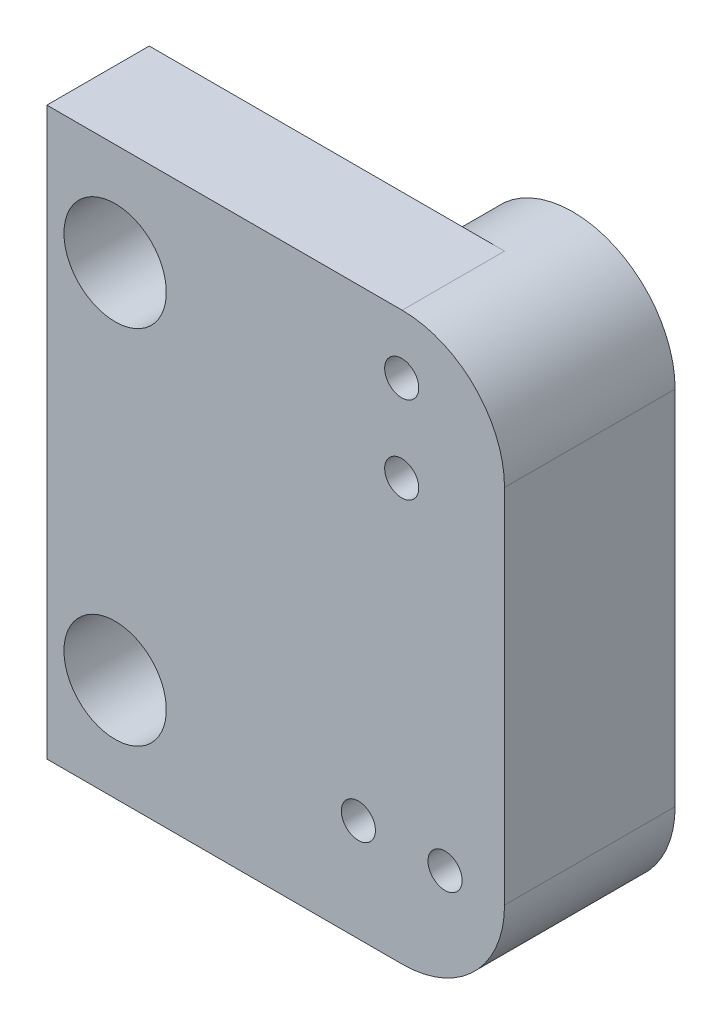
ISO-10303-21;
HEADER;
FILE_DESCRIPTION(('STEP AP214'),'2;1');
FILE_NAME('part.step','',(''),(''),'','','');
FILE_SCHEMA(('AUTOMOTIVE_DESIGN { 1 0 10303 214 1 1 1 1 }'));
ENDSEC;
DATA;
#1=APPLICATION_CONTEXT('core data for automotive mechanical design processes');
#2=APPLICATION_PROTOCOL_DEFINITION('international standard','automotive_design',2000,#1);
#3=PRODUCT_CONTEXT('',#1,'mechanical');
#4=PRODUCT('Part','Part','',(#3));
#5=PRODUCT_RELATED_PRODUCT_CATEGORY('part','',(#4));
#6=PRODUCT_DEFINITION_FORMATION('','',#4);
#7=PRODUCT_DEFINITION_CONTEXT('part definition',#1,'design');
#8=PRODUCT_DEFINITION('design','',#6,#7);
#9=PRODUCT_DEFINITION_SHAPE('','',#8);
#10=(LENGTH_UNIT() NAMED_UNIT(*) SI_UNIT(.MILLI.,.METRE.));
#11=(NAMED_UNIT(*) PLANE_ANGLE_UNIT() SI_UNIT($,.RADIAN.));
#12=(NAMED_UNIT(*) SI_UNIT($,.STERADIAN.) SOLID_ANGLE_UNIT());
#13=UNCERTAINTY_MEASURE_WITH_UNIT(LENGTH_MEASURE(1.E-05),#10,'distance_accuracy_value','');
#14=(GEOMETRIC_REPRESENTATION_CONTEXT(3) GLOBAL_UNCERTAINTY_ASSIGNED_CONTEXT((#13)) GLOBAL_UNIT_ASSIGNED_CONTEXT((#10,
#11,#12)) REPRESENTATION_CONTEXT('',''));
#15=CARTESIAN_POINT('',(0.,0.,0.));
#16=DIRECTION('',(0.,0.,1.));
#17=DIRECTION('',(1.,0.,0.));
#18=AXIS2_PLACEMENT_3D('',#15,#16,#17);
#19=CARTESIAN_POINT('',(0.,5.27451513374679,-6.28985821859934));
#20=DIRECTION('',(0.,-1.,0.));
#21=DIRECTION('',(1.,0.,0.));
#22=AXIS2_PLACEMENT_3D('',#19,#20,#21);
#23=PLANE('',#22);
#24=DIRECTION('',(1.,0.,0.));
#25=VECTOR('',#24,1.);
#26=CARTESIAN_POINT('',(0.,5.27451513374679,-6.28985821859934));
#27=LINE('',#26,#25);
#28=CARTESIAN_POINT('',(-15.5390857664016,5.2745151337468,-6.28985821859934));
#29=VERTEX_POINT('',#28);
#30=CARTESIAN_POINT('',(-5.12559757679926,5.27451513374679,-6.28985821859934));
#31=VERTEX_POINT('',#30);
#32=EDGE_CURVE('E119',#29,#31,#27,.T.);
#33=ORIENTED_EDGE('',*,*,#32,.T.);
#34=DIRECTION('',(0.,0.,-1.));
#35=VECTOR('',#34,1.);
#36=CARTESIAN_POINT('',(-5.12559757679926,5.27451513374679,3.71014178140066));
#37=LINE('',#36,#35);
#38=CARTESIAN_POINT('',(-5.12559757679926,5.27451513374679,-3.28985821859934));
#39=VERTEX_POINT('',#38);
#40=EDGE_CURVE('E101',#39,#31,#37,.T.);
#41=ORIENTED_EDGE('',*,*,#40,.F.);
#42=DIRECTION('',(1.,0.,0.));
#43=VECTOR('',#42,1.);
#44=CARTESIAN_POINT('',(0.,5.27451513374679,-3.28985821859934));
#45=LINE('',#44,#43);
#46=CARTESIAN_POINT('',(-15.5390857664016,5.2745151337468,-3.28985821859934));
#47=VERTEX_POINT('',#46);
#48=EDGE_CURVE('E146',#47,#39,#45,.T.);
#49=ORIENTED_EDGE('',*,*,#48,.F.);
#50=DIRECTION('',(0.,0.,1.));
#51=VECTOR('',#50,1.);
#52=CARTESIAN_POINT('',(-15.5390857664016,5.2745151337468,-6.28985821859934));
#53=LINE('',#52,#51);
#54=EDGE_CURVE('E124',#29,#47,#53,.T.);
#55=ORIENTED_EDGE('',*,*,#54,.F.);
#56=EDGE_LOOP('',(#33,#41,#49,#55));
#57=FACE_BOUND('',#56,.T.);
#58=ADVANCED_FACE('F36',(#57),#23,.T.);
#59=CARTESIAN_POINT('',(-5.12559757679926,8.27451513374679,-3.28985821859934));
#60=DIRECTION('',(0.,0.,-1.));
#61=DIRECTION('',(-1.,0.,0.));
#62=AXIS2_PLACEMENT_3D('',#59,#60,#61);
#63=PLANE('',#62);
#64=CARTESIAN_POINT('',(-13.5390857664016,18.8745151337471,-3.28985821859934));
#65=DIRECTION('',(0.,0.,-1.));
#66=DIRECTION('',(-1.,0.,0.));
#67=AXIS2_PLACEMENT_3D('',#64,#65,#66);
#68=CIRCLE('',#67,1.5);
#69=CARTESIAN_POINT('',(-15.0390857664016,18.8745151337471,-3.28985821859934));
#70=VERTEX_POINT('',#69);
#71=EDGE_CURVE('E127',#70,#70,#68,.T.);
#72=ORIENTED_EDGE('',*,*,#71,.T.);
#73=EDGE_LOOP('',(#72));
#74=FACE_BOUND('',#73,.T.);
#75=CARTESIAN_POINT('',(-13.5390857664016,8.27451513374718,-3.28985821859934));
#76=DIRECTION('',(0.,0.,-1.));
#77=DIRECTION('',(-1.,0.,0.));
#78=AXIS2_PLACEMENT_3D('',#75,#76,#77);
#79=CIRCLE('',#78,1.5);
#80=CARTESIAN_POINT('',(-15.0390857664016,8.27451513374718,-3.28985821859934));
#81=VERTEX_POINT('',#80);
#82=EDGE_CURVE('E132',#81,#81,#79,.T.);
#83=ORIENTED_EDGE('',*,*,#82,.T.);
#84=EDGE_LOOP('',(#83));
#85=FACE_BOUND('',#84,.T.);
#86=CARTESIAN_POINT('',(-6.40908576640162,8.27451513374708,-3.28985821859934));
#87=DIRECTION('',(0.,0.,-1.));
#88=DIRECTION('',(-1.,0.,0.));
#89=AXIS2_PLACEMENT_3D('',#86,#87,#88);
#90=CIRCLE('',#89,0.500000000000001);
#91=CARTESIAN_POINT('',(-6.90908576640162,8.27451513374708,-3.28985821859934));
#92=VERTEX_POINT('',#91);
#93=EDGE_CURVE('E209',#92,#92,#90,.T.);
#94=ORIENTED_EDGE('',*,*,#93,.T.);
#95=EDGE_LOOP('',(#94));
#96=FACE_BOUND('',#95,.T.);
#97=CARTESIAN_POINT('',(-3.86908576640163,8.27451513374708,-3.28985821859934));
#98=DIRECTION('',(0.,0.,-1.));
#99=DIRECTION('',(-1.,0.,0.));
#100=AXIS2_PLACEMENT_3D('',#97,#98,#99);
#101=CIRCLE('',#100,0.5);
#102=CARTESIAN_POINT('',(-4.36908576640163,8.27451513374708,-3.28985821859934));
#103=VERTEX_POINT('',#102);
#104=EDGE_CURVE('E212',#103,#103,#101,.T.);
#105=ORIENTED_EDGE('',*,*,#104,.T.);
#106=EDGE_LOOP('',(#105));
#107=FACE_BOUND('',#106,.T.);
#108=CARTESIAN_POINT('',(-5.13908576640162,17.6045151337471,-3.28985821859934));
#109=DIRECTION('',(0.,0.,-1.));
#110=DIRECTION('',(-1.,0.,0.));
#111=AXIS2_PLACEMENT_3D('',#108,#109,#110);
#112=CIRCLE('',#111,0.500000000000001);
#113=CARTESIAN_POINT('',(-5.63908576640162,17.6045151337471,-3.28985821859934));
#114=VERTEX_POINT('',#113);
#115=EDGE_CURVE('E217',#114,#114,#112,.T.);
#116=ORIENTED_EDGE('',*,*,#115,.T.);
#117=EDGE_LOOP('',(#116));
#118=FACE_BOUND('',#117,.T.);
#119=CARTESIAN_POINT('',(-5.13908576640162,20.1445151337471,-3.28985821859934));
#120=DIRECTION('',(0.,0.,-1.));
#121=DIRECTION('',(-1.,0.,0.));
#122=AXIS2_PLACEMENT_3D('',#119,#120,#121);
#123=CIRCLE('',#122,0.5);
#124=CARTESIAN_POINT('',(-5.63908576640162,20.1445151337471,-3.28985821859934));
#125=VERTEX_POINT('',#124);
#126=EDGE_CURVE('E192',#125,#125,#123,.T.);
#127=ORIENTED_EDGE('',*,*,#126,.T.);
#128=EDGE_LOOP('',(#127));
#129=FACE_BOUND('',#128,.T.);
#130=DIRECTION('',(0.,1.,0.));
#131=VECTOR('',#130,1.);
#132=CARTESIAN_POINT('',(-2.12559757679925,8.27451513374679,-3.28985821859934));
#133=LINE('',#132,#131);
#134=CARTESIAN_POINT('',(-2.12559757679925,8.27451513374679,-3.28985821859934));
#135=VERTEX_POINT('',#134);
#136=CARTESIAN_POINT('',(-2.12559757679924,18.8745151337471,-3.28985821859934));
#137=VERTEX_POINT('',#136);
#138=EDGE_CURVE('E44',#135,#137,#133,.T.);
#139=ORIENTED_EDGE('',*,*,#138,.T.);
#140=CARTESIAN_POINT('',(-5.12559757679926,18.8745151337471,-3.28985821859934));
#141=DIRECTION('',(0.,0.,-1.));
#142=DIRECTION('',(-1.,0.,0.));
#143=AXIS2_PLACEMENT_3D('',#140,#141,#142);
#144=CIRCLE('',#143,3.00000000000001);
#145=CARTESIAN_POINT('',(-5.12559757679925,21.8745151337471,-3.28985821859934));
#146=VERTEX_POINT('',#145);
#147=EDGE_CURVE('E11',#137,#146,#144,.F.);
#148=ORIENTED_EDGE('',*,*,#147,.T.);
#149=DIRECTION('',(-1.,0.,0.));
#150=VECTOR('',#149,1.);
#151=CARTESIAN_POINT('',(0.,21.8745151337471,-3.28985821859934));
#152=LINE('',#151,#150);
#153=CARTESIAN_POINT('',(-15.5390857664016,21.8745151337471,-3.28985821859934));
#154=VERTEX_POINT('',#153);
#155=EDGE_CURVE('E151',#146,#154,#152,.T.);
#156=ORIENTED_EDGE('',*,*,#155,.T.);
#157=DIRECTION('',(0.,-1.,0.));
#158=VECTOR('',#157,1.);
#159=CARTESIAN_POINT('',(-15.5390857664016,0.,-3.28985821859934));
#160=LINE('',#159,#158);
#161=EDGE_CURVE('E148',#154,#47,#160,.T.);
#162=ORIENTED_EDGE('',*,*,#161,.T.);
#163=ORIENTED_EDGE('',*,*,#48,.T.);
#164=CARTESIAN_POINT('',(-5.12559757679926,8.27451513374679,-3.28985821859934));
#165=DIRECTION('',(0.,0.,-1.));
#166=DIRECTION('',(-1.,0.,0.));
#167=AXIS2_PLACEMENT_3D('',#164,#165,#166);
#168=CIRCLE('',#167,3.);
#169=EDGE_CURVE('E107',#39,#135,#168,.F.);
#170=ORIENTED_EDGE('',*,*,#169,.T.);
#171=EDGE_LOOP('',(#139,#148,#156,#162,#163,#170));
#172=FACE_BOUND('',#171,.T.);
#173=ADVANCED_FACE('F198',(#74,#85,#96,#107,#118,#129,#172),#63,.F.);
#174=CARTESIAN_POINT('',(0.,21.8745151337471,-6.28985821859934));
#175=DIRECTION('',(0.,1.,0.));
#176=DIRECTION('',(-1.,0.,0.));
#177=AXIS2_PLACEMENT_3D('',#174,#175,#176);
#178=PLANE('',#177);
#179=DIRECTION('',(0.,0.,-1.));
#180=VECTOR('',#179,1.);
#181=CARTESIAN_POINT('',(-5.12559757679925,21.8745151337471,3.71014178140066));
#182=LINE('',#181,#180);
#183=CARTESIAN_POINT('',(-5.12559757679925,21.8745151337471,-6.28985821859934));
#184=VERTEX_POINT('',#183);
#185=EDGE_CURVE('E112',#146,#184,#182,.T.);
#186=ORIENTED_EDGE('',*,*,#185,.T.);
#187=DIRECTION('',(-1.,0.,0.));
#188=VECTOR('',#187,1.);
#189=CARTESIAN_POINT('',(0.,21.8745151337471,-6.28985821859934));
#190=LINE('',#189,#188);
#191=CARTESIAN_POINT('',(-15.5390857664016,21.8745151337471,-6.28985821859934));
#192=VERTEX_POINT('',#191);
#193=EDGE_CURVE('E129',#184,#192,#190,.T.);
#194=ORIENTED_EDGE('',*,*,#193,.T.);
#195=DIRECTION('',(0.,0.,1.));
#196=VECTOR('',#195,1.);
#197=CARTESIAN_POINT('',(-15.5390857664016,21.8745151337471,-6.28985821859934));
#198=LINE('',#197,#196);
#199=EDGE_CURVE('E145',#192,#154,#198,.T.);
#200=ORIENTED_EDGE('',*,*,#199,.T.);
#201=ORIENTED_EDGE('',*,*,#155,.F.);
#202=EDGE_LOOP('',(#186,#194,#200,#201));
#203=FACE_BOUND('',#202,.T.);
#204=ADVANCED_FACE('F262',(#203),#178,.T.);
#205=CARTESIAN_POINT('',(0.,0.,-6.28985821859934));
#206=DIRECTION('',(0.,0.,-1.));
#207=DIRECTION('',(-1.,0.,0.));
#208=AXIS2_PLACEMENT_3D('',#205,#206,#207);
#209=PLANE('',#208);
#210=DIRECTION('',(0.,1.,0.));
#211=VECTOR('',#210,1.);
#212=CARTESIAN_POINT('',(-8.12559757679926,8.27451513374679,-6.28985821859934));
#213=LINE('',#212,#211);
#214=CARTESIAN_POINT('',(-8.12559757679926,8.27451513374679,-6.28985821859934));
#215=VERTEX_POINT('',#214);
#216=CARTESIAN_POINT('',(-8.12559757679927,18.8745151337471,-6.28985821859934));
#217=VERTEX_POINT('',#216);
#218=EDGE_CURVE('E122',#215,#217,#213,.T.);
#219=ORIENTED_EDGE('',*,*,#218,.F.);
#220=CARTESIAN_POINT('',(-5.12559757679926,8.27451513374679,-6.28985821859934));
#221=DIRECTION('',(0.,0.,-1.));
#222=DIRECTION('',(-1.,0.,0.));
#223=AXIS2_PLACEMENT_3D('',#220,#221,#222);
#224=CIRCLE('',#223,3.);
#225=EDGE_CURVE('E104',#31,#215,#224,.T.);
#226=ORIENTED_EDGE('',*,*,#225,.F.);
#227=ORIENTED_EDGE('',*,*,#32,.F.);
#228=DIRECTION('',(0.,-1.,0.));
#229=VECTOR('',#228,1.);
#230=CARTESIAN_POINT('',(-15.5390857664016,0.,-6.28985821859934));
#231=LINE('',#230,#229);
#232=EDGE_CURVE('E126',#192,#29,#231,.T.);
#233=ORIENTED_EDGE('',*,*,#232,.F.);
#234=ORIENTED_EDGE('',*,*,#193,.F.);
#235=CARTESIAN_POINT('',(-5.12559757679926,18.8745151337471,-6.28985821859934));
#236=DIRECTION('',(0.,0.,-1.));
#237=DIRECTION('',(-1.,0.,0.));
#238=AXIS2_PLACEMENT_3D('',#235,#236,#237);
#239=CIRCLE('',#238,3.00000000000001);
#240=EDGE_CURVE('E123',#217,#184,#239,.T.);
#241=ORIENTED_EDGE('',*,*,#240,.F.);
#242=EDGE_LOOP('',(#219,#226,#227,#233,#234,#241));
#243=FACE_BOUND('',#242,.T.);
#244=CARTESIAN_POINT('',(-13.5390857664016,18.8745151337471,-6.28985821859934));
#245=DIRECTION('',(0.,0.,-1.));
#246=DIRECTION('',(-1.,0.,0.));
#247=AXIS2_PLACEMENT_3D('',#244,#245,#246);
#248=CIRCLE('',#247,1.5);
#249=CARTESIAN_POINT('',(-15.0390857664016,18.8745151337471,-6.28985821859934));
#250=VERTEX_POINT('',#249);
#251=EDGE_CURVE('E142',#250,#250,#248,.T.);
#252=ORIENTED_EDGE('',*,*,#251,.F.);
#253=EDGE_LOOP('',(#252));
#254=FACE_BOUND('',#253,.T.);
#255=CARTESIAN_POINT('',(-13.5390857664016,8.27451513374718,-6.28985821859934));
#256=DIRECTION('',(0.,0.,-1.));
#257=DIRECTION('',(-1.,0.,0.));
#258=AXIS2_PLACEMENT_3D('',#255,#256,#257);
#259=CIRCLE('',#258,1.5);
#260=CARTESIAN_POINT('',(-15.0390857664016,8.27451513374718,-6.28985821859934));
#261=VERTEX_POINT('',#260);
#262=EDGE_CURVE('E139',#261,#261,#259,.T.);
#263=ORIENTED_EDGE('',*,*,#262,.F.);
#264=EDGE_LOOP('',(#263));
#265=FACE_BOUND('',#264,.T.);
#266=ADVANCED_FACE('F116',(#243,#254,#265),#209,.T.);
#267=CARTESIAN_POINT('',(-15.5390857664016,0.,-6.28985821859934));
#268=DIRECTION('',(-1.,0.,0.));
#269=DIRECTION('',(0.,-1.,0.));
#270=AXIS2_PLACEMENT_3D('',#267,#268,#269);
#271=PLANE('',#270);
#272=ORIENTED_EDGE('',*,*,#161,.F.);
#273=ORIENTED_EDGE('',*,*,#199,.F.);
#274=ORIENTED_EDGE('',*,*,#232,.T.);
#275=ORIENTED_EDGE('',*,*,#54,.T.);
#276=EDGE_LOOP('',(#272,#273,#274,#275));
#277=FACE_BOUND('',#276,.T.);
#278=ADVANCED_FACE('F266',(#277),#271,.T.);
#279=CARTESIAN_POINT('',(-13.5390857664016,18.8745151337471,-6.28985821859934));
#280=DIRECTION('',(0.,0.,1.));
#281=DIRECTION('',(1.,0.,0.));
#282=AXIS2_PLACEMENT_3D('',#279,#280,#281);
#283=CYLINDRICAL_SURFACE('',#282,1.5);
#284=ORIENTED_EDGE('',*,*,#251,.T.);
#285=EDGE_LOOP('',(#284));
#286=FACE_BOUND('',#285,.T.);
#287=ORIENTED_EDGE('',*,*,#71,.F.);
#288=EDGE_LOOP('',(#287));
#289=FACE_BOUND('',#288,.T.);
#290=ADVANCED_FACE('F269',(#286,#289),#283,.F.);
#291=CARTESIAN_POINT('',(-13.5390857664016,8.27451513374718,-6.28985821859934));
#292=DIRECTION('',(0.,0.,1.));
#293=DIRECTION('',(1.,0.,0.));
#294=AXIS2_PLACEMENT_3D('',#291,#292,#293);
#295=CYLINDRICAL_SURFACE('',#294,1.5);
#296=ORIENTED_EDGE('',*,*,#262,.T.);
#297=EDGE_LOOP('',(#296));
#298=FACE_BOUND('',#297,.T.);
#299=ORIENTED_EDGE('',*,*,#82,.F.);
#300=EDGE_LOOP('',(#299));
#301=FACE_BOUND('',#300,.T.);
#302=ADVANCED_FACE('F273',(#298,#301),#295,.F.);
#303=CARTESIAN_POINT('',(-2.12559757679925,8.27451513374679,-8.28985821859934));
#304=DIRECTION('',(-1.,0.,0.));
#305=DIRECTION('',(0.,-1.,0.));
#306=AXIS2_PLACEMENT_3D('',#303,#304,#305);
#307=PLANE('',#306);
#308=DIRECTION('',(0.,0.,1.));
#309=VECTOR('',#308,1.);
#310=CARTESIAN_POINT('',(-2.12559757679923,18.8745151337471,-8.28985821859934));
#311=LINE('',#310,#309);
#312=CARTESIAN_POINT('',(-2.12559757679923,18.8745151337471,-8.28985821859934));
#313=VERTEX_POINT('',#312);
#314=EDGE_CURVE('E179',#313,#137,#311,.T.);
#315=ORIENTED_EDGE('',*,*,#314,.T.);
#316=ORIENTED_EDGE('',*,*,#138,.F.);
#317=DIRECTION('',(0.,0.,1.));
#318=VECTOR('',#317,1.);
#319=CARTESIAN_POINT('',(-2.12559757679925,8.27451513374679,-8.28985821859934));
#320=LINE('',#319,#318);
#321=CARTESIAN_POINT('',(-2.12559757679925,8.27451513374679,-8.28985821859934));
#322=VERTEX_POINT('',#321);
#323=EDGE_CURVE('E51',#322,#135,#320,.T.);
#324=ORIENTED_EDGE('',*,*,#323,.F.);
#325=DIRECTION('',(0.,-1.,0.));
#326=VECTOR('',#325,1.);
#327=CARTESIAN_POINT('',(-2.12559757679925,8.27451513374679,-8.28985821859934));
#328=LINE('',#327,#326);
#329=EDGE_CURVE('E59',#313,#322,#328,.T.);
#330=ORIENTED_EDGE('',*,*,#329,.F.);
#331=EDGE_LOOP('',(#315,#316,#324,#330));
#332=FACE_BOUND('',#331,.T.);
#333=ADVANCED_FACE('F202',(#332),#307,.F.);
#334=CARTESIAN_POINT('',(-5.12559757679926,18.8745151337471,-8.28985821859934));
#335=DIRECTION('',(0.,0.,1.));
#336=DIRECTION('',(1.,0.,0.));
#337=AXIS2_PLACEMENT_3D('',#334,#335,#336);
#338=CYLINDRICAL_SURFACE('',#337,3.00000000000001);
#339=ORIENTED_EDGE('',*,*,#240,.T.);
#340=ORIENTED_EDGE('',*,*,#185,.F.);
#341=ORIENTED_EDGE('',*,*,#147,.F.);
#342=ORIENTED_EDGE('',*,*,#314,.F.);
#343=CARTESIAN_POINT('',(-5.12559757679926,18.8745151337471,-8.28985821859934));
#344=DIRECTION('',(0.,0.,-1.));
#345=DIRECTION('',(-1.,0.,0.));
#346=AXIS2_PLACEMENT_3D('',#343,#344,#345);
#347=CIRCLE('',#346,3.00000000000001);
#348=CARTESIAN_POINT('',(-8.12559757679927,18.8745151337471,-8.28985821859934));
#349=VERTEX_POINT('',#348);
#350=EDGE_CURVE('E175',#349,#313,#347,.T.);
#351=ORIENTED_EDGE('',*,*,#350,.F.);
#352=DIRECTION('',(0.,0.,1.));
#353=VECTOR('',#352,1.);
#354=CARTESIAN_POINT('',(-8.12559757679927,18.8745151337471,-8.28985821859934));
#355=LINE('',#354,#353);
#356=EDGE_CURVE('E181',#349,#217,#355,.T.);
#357=ORIENTED_EDGE('',*,*,#356,.T.);
#358=EDGE_LOOP('',(#339,#340,#341,#342,#351,#357));
#359=FACE_BOUND('',#358,.T.);
#360=ADVANCED_FACE('F206',(#359),#338,.T.);
#361=CARTESIAN_POINT('',(-8.12559757679926,8.27451513374679,-8.28985821859934));
#362=DIRECTION('',(1.,0.,0.));
#363=DIRECTION('',(0.,0.,-1.));
#364=AXIS2_PLACEMENT_3D('',#361,#362,#363);
#365=PLANE('',#364);
#366=DIRECTION('',(0.,0.,1.));
#367=VECTOR('',#366,1.);
#368=CARTESIAN_POINT('',(-8.12559757679926,8.27451513374679,-8.28985821859934));
#369=LINE('',#368,#367);
#370=CARTESIAN_POINT('',(-8.12559757679926,8.27451513374679,-8.28985821859934));
#371=VERTEX_POINT('',#370);
#372=EDGE_CURVE('E184',#371,#215,#369,.T.);
#373=ORIENTED_EDGE('',*,*,#372,.T.);
#374=ORIENTED_EDGE('',*,*,#218,.T.);
#375=ORIENTED_EDGE('',*,*,#356,.F.);
#376=DIRECTION('',(0.,1.,0.));
#377=VECTOR('',#376,1.);
#378=CARTESIAN_POINT('',(-8.12559757679926,8.27451513374679,-8.28985821859934));
#379=LINE('',#378,#377);
#380=EDGE_CURVE('E173',#371,#349,#379,.T.);
#381=ORIENTED_EDGE('',*,*,#380,.F.);
#382=EDGE_LOOP('',(#373,#374,#375,#381));
#383=FACE_BOUND('',#382,.T.);
#384=ADVANCED_FACE('F337',(#383),#365,.F.);
#385=CARTESIAN_POINT('',(-5.12559757679926,8.27451513374679,-8.28985821859934));
#386=DIRECTION('',(0.,0.,1.));
#387=DIRECTION('',(1.,0.,0.));
#388=AXIS2_PLACEMENT_3D('',#385,#386,#387);
#389=CYLINDRICAL_SURFACE('',#388,3.);
#390=ORIENTED_EDGE('',*,*,#323,.T.);
#391=ORIENTED_EDGE('',*,*,#169,.F.);
#392=ORIENTED_EDGE('',*,*,#40,.T.);
#393=ORIENTED_EDGE('',*,*,#225,.T.);
#394=ORIENTED_EDGE('',*,*,#372,.F.);
#395=CARTESIAN_POINT('',(-5.12559757679926,8.27451513374679,-8.28985821859934));
#396=DIRECTION('',(0.,0.,-1.));
#397=DIRECTION('',(-1.,0.,0.));
#398=AXIS2_PLACEMENT_3D('',#395,#396,#397);
#399=CIRCLE('',#398,3.);
#400=EDGE_CURVE('E171',#322,#371,#399,.T.);
#401=ORIENTED_EDGE('',*,*,#400,.F.);
#402=EDGE_LOOP('',(#390,#391,#392,#393,#394,#401));
#403=FACE_BOUND('',#402,.T.);
#404=ADVANCED_FACE('F38',(#403),#389,.T.);
#405=CARTESIAN_POINT('',(-5.12559757679926,18.8745151337471,-8.28985821859934));
#406=DIRECTION('',(0.,0.,1.));
#407=DIRECTION('',(1.,0.,0.));
#408=AXIS2_PLACEMENT_3D('',#405,#406,#407);
#409=CYLINDRICAL_SURFACE('',#408,2.5);
#410=CARTESIAN_POINT('',(-5.12559757679926,18.8745151337471,-6.28985821859934));
#411=DIRECTION('',(0.,0.,-1.));
#412=DIRECTION('',(-1.,0.,0.));
#413=AXIS2_PLACEMENT_3D('',#410,#411,#412);
#414=CIRCLE('',#413,2.5);
#415=CARTESIAN_POINT('',(-7.62559757679926,18.8745151337471,-6.28985821859934));
#416=VERTEX_POINT('',#415);
#417=EDGE_CURVE('E158',#416,#416,#414,.T.);
#418=ORIENTED_EDGE('',*,*,#417,.F.);
#419=EDGE_LOOP('',(#418));
#420=FACE_BOUND('',#419,.T.);
#421=CARTESIAN_POINT('',(-5.12559757679926,18.8745151337471,-8.28985821859934));
#422=DIRECTION('',(0.,0.,-1.));
#423=DIRECTION('',(-1.,0.,0.));
#424=AXIS2_PLACEMENT_3D('',#421,#422,#423);
#425=CIRCLE('',#424,2.5);
#426=CARTESIAN_POINT('',(-7.62559757679926,18.8745151337471,-8.28985821859934));
#427=VERTEX_POINT('',#426);
#428=EDGE_CURVE('E168',#427,#427,#425,.T.);
#429=ORIENTED_EDGE('',*,*,#428,.T.);
#430=EDGE_LOOP('',(#429));
#431=FACE_BOUND('',#430,.T.);
#432=ADVANCED_FACE('F239',(#420,#431),#409,.F.);
#433=CARTESIAN_POINT('',(-5.12559757679926,8.27451513374679,-8.28985821859934));
#434=DIRECTION('',(0.,0.,-1.));
#435=DIRECTION('',(-1.,0.,0.));
#436=AXIS2_PLACEMENT_3D('',#433,#434,#435);
#437=PLANE('',#436);
#438=ORIENTED_EDGE('',*,*,#428,.F.);
#439=EDGE_LOOP('',(#438));
#440=FACE_BOUND('',#439,.T.);
#441=ORIENTED_EDGE('',*,*,#400,.T.);
#442=ORIENTED_EDGE('',*,*,#380,.T.);
#443=ORIENTED_EDGE('',*,*,#350,.T.);
#444=ORIENTED_EDGE('',*,*,#329,.T.);
#445=EDGE_LOOP('',(#441,#442,#443,#444));
#446=FACE_BOUND('',#445,.T.);
#447=CARTESIAN_POINT('',(-5.12559757679926,8.27451513374679,-8.28985821859934));
#448=DIRECTION('',(0.,0.,-1.));
#449=DIRECTION('',(-1.,0.,0.));
#450=AXIS2_PLACEMENT_3D('',#447,#448,#449);
#451=CIRCLE('',#450,2.5);
#452=CARTESIAN_POINT('',(-7.62559757679926,8.27451513374679,-8.28985821859934));
#453=VERTEX_POINT('',#452);
#454=EDGE_CURVE('E165',#453,#453,#451,.T.);
#455=ORIENTED_EDGE('',*,*,#454,.F.);
#456=EDGE_LOOP('',(#455));
#457=FACE_BOUND('',#456,.T.);
#458=ADVANCED_FACE('F242',(#440,#446,#457),#437,.T.);
#459=CARTESIAN_POINT('',(-5.12559757679926,8.27451513374679,-8.28985821859934));
#460=DIRECTION('',(0.,0.,1.));
#461=DIRECTION('',(1.,0.,0.));
#462=AXIS2_PLACEMENT_3D('',#459,#460,#461);
#463=CYLINDRICAL_SURFACE('',#462,2.5);
#464=CARTESIAN_POINT('',(-5.12559757679926,8.27451513374679,-6.28985821859934));
#465=DIRECTION('',(0.,0.,-1.));
#466=DIRECTION('',(-1.,0.,0.));
#467=AXIS2_PLACEMENT_3D('',#464,#465,#466);
#468=CIRCLE('',#467,2.5);
#469=CARTESIAN_POINT('',(-7.62559757679926,8.27451513374679,-6.28985821859934));
#470=VERTEX_POINT('',#469);
#471=EDGE_CURVE('E161',#470,#470,#468,.T.);
#472=ORIENTED_EDGE('',*,*,#471,.F.);
#473=EDGE_LOOP('',(#472));
#474=FACE_BOUND('',#473,.T.);
#475=ORIENTED_EDGE('',*,*,#454,.T.);
#476=EDGE_LOOP('',(#475));
#477=FACE_BOUND('',#476,.T.);
#478=ADVANCED_FACE('F234',(#474,#477),#463,.F.);
#479=CARTESIAN_POINT('',(-5.13908576640162,20.1445151337471,-6.28985821859934));
#480=DIRECTION('',(0.,0.,-1.));
#481=DIRECTION('',(-1.,0.,0.));
#482=AXIS2_PLACEMENT_3D('',#479,#480,#481);
#483=CIRCLE('',#482,0.5);
#484=CARTESIAN_POINT('',(-5.63908576640162,20.1445151337471,-6.28985821859934));
#485=VERTEX_POINT('',#484);
#486=EDGE_CURVE('E135',#485,#485,#483,.T.);
#487=ORIENTED_EDGE('',*,*,#486,.F.);
#488=EDGE_LOOP('',(#487));
#489=FACE_BOUND('',#488,.T.);
#490=CARTESIAN_POINT('',(-5.13908576640162,17.6045151337471,-6.28985821859934));
#491=DIRECTION('',(0.,0.,-1.));
#492=DIRECTION('',(-1.,0.,0.));
#493=AXIS2_PLACEMENT_3D('',#490,#491,#492);
#494=CIRCLE('',#493,0.500000000000001);
#495=CARTESIAN_POINT('',(-5.63908576640162,17.6045151337471,-6.28985821859934));
#496=VERTEX_POINT('',#495);
#497=EDGE_CURVE('E195',#496,#496,#494,.T.);
#498=ORIENTED_EDGE('',*,*,#497,.F.);
#499=EDGE_LOOP('',(#498));
#500=FACE_BOUND('',#499,.T.);
#501=ORIENTED_EDGE('',*,*,#417,.T.);
#502=EDGE_LOOP('',(#501));
#503=FACE_BOUND('',#502,.T.);
#504=ADVANCED_FACE('F230',(#489,#500,#503),#209,.T.);
#505=CARTESIAN_POINT('',(-3.86908576640163,8.27451513374708,-6.28985821859934));
#506=DIRECTION('',(0.,0.,-1.));
#507=DIRECTION('',(-1.,0.,0.));
#508=AXIS2_PLACEMENT_3D('',#505,#506,#507);
#509=CIRCLE('',#508,0.5);
#510=CARTESIAN_POINT('',(-4.36908576640163,8.27451513374708,-6.28985821859934));
#511=VERTEX_POINT('',#510);
#512=EDGE_CURVE('E191',#511,#511,#509,.T.);
#513=ORIENTED_EDGE('',*,*,#512,.F.);
#514=EDGE_LOOP('',(#513));
#515=FACE_BOUND('',#514,.T.);
#516=CARTESIAN_POINT('',(-6.40908576640162,8.27451513374708,-6.28985821859934));
#517=DIRECTION('',(0.,0.,-1.));
#518=DIRECTION('',(-1.,0.,0.));
#519=AXIS2_PLACEMENT_3D('',#516,#517,#518);
#520=CIRCLE('',#519,0.500000000000001);
#521=CARTESIAN_POINT('',(-6.90908576640162,8.27451513374708,-6.28985821859934));
#522=VERTEX_POINT('',#521);
#523=EDGE_CURVE('E188',#522,#522,#520,.T.);
#524=ORIENTED_EDGE('',*,*,#523,.F.);
#525=EDGE_LOOP('',(#524));
#526=FACE_BOUND('',#525,.T.);
#527=ORIENTED_EDGE('',*,*,#471,.T.);
#528=EDGE_LOOP('',(#527));
#529=FACE_BOUND('',#528,.T.);
#530=ADVANCED_FACE('F233',(#515,#526,#529),#209,.T.);
#531=CARTESIAN_POINT('',(-6.40908576640162,8.27451513374708,-3.28985821859934));
#532=DIRECTION('',(0.,0.,-1.));
#533=DIRECTION('',(-1.,0.,0.));
#534=AXIS2_PLACEMENT_3D('',#531,#532,#533);
#535=CYLINDRICAL_SURFACE('',#534,0.500000000000001);
#536=ORIENTED_EDGE('',*,*,#523,.T.);
#537=EDGE_LOOP('',(#536));
#538=FACE_BOUND('',#537,.T.);
#539=ORIENTED_EDGE('',*,*,#93,.F.);
#540=EDGE_LOOP('',(#539));
#541=FACE_BOUND('',#540,.T.);
#542=ADVANCED_FACE('F281',(#538,#541),#535,.F.);
#543=CARTESIAN_POINT('',(-3.86908576640163,8.27451513374708,-3.28985821859934));
#544=DIRECTION('',(0.,0.,-1.));
#545=DIRECTION('',(-1.,0.,0.));
#546=AXIS2_PLACEMENT_3D('',#543,#544,#545);
#547=CYLINDRICAL_SURFACE('',#546,0.5);
#548=ORIENTED_EDGE('',*,*,#512,.T.);
#549=EDGE_LOOP('',(#548));
#550=FACE_BOUND('',#549,.T.);
#551=ORIENTED_EDGE('',*,*,#104,.F.);
#552=EDGE_LOOP('',(#551));
#553=FACE_BOUND('',#552,.T.);
#554=ADVANCED_FACE('F284',(#550,#553),#547,.F.);
#555=CARTESIAN_POINT('',(-5.13908576640162,17.6045151337471,-3.28985821859934));
#556=DIRECTION('',(0.,0.,-1.));
#557=DIRECTION('',(-1.,0.,0.));
#558=AXIS2_PLACEMENT_3D('',#555,#556,#557);
#559=CYLINDRICAL_SURFACE('',#558,0.500000000000001);
#560=ORIENTED_EDGE('',*,*,#497,.T.);
#561=EDGE_LOOP('',(#560));
#562=FACE_BOUND('',#561,.T.);
#563=ORIENTED_EDGE('',*,*,#115,.F.);
#564=EDGE_LOOP('',(#563));
#565=FACE_BOUND('',#564,.T.);
#566=ADVANCED_FACE('F288',(#562,#565),#559,.F.);
#567=CARTESIAN_POINT('',(-5.13908576640162,20.1445151337471,-3.28985821859934));
#568=DIRECTION('',(0.,0.,-1.));
#569=DIRECTION('',(-1.,0.,0.));
#570=AXIS2_PLACEMENT_3D('',#567,#568,#569);
#571=CYLINDRICAL_SURFACE('',#570,0.5);
#572=ORIENTED_EDGE('',*,*,#486,.T.);
#573=EDGE_LOOP('',(#572));
#574=FACE_BOUND('',#573,.T.);
#575=ORIENTED_EDGE('',*,*,#126,.F.);
#576=EDGE_LOOP('',(#575));
#577=FACE_BOUND('',#576,.T.);
#578=ADVANCED_FACE('F227',(#574,#577),#571,.F.);
#579=CLOSED_SHELL('',(#58,#173,#204,#266,#278,#290,#302,#333,#360,#384,#404,#432,#458,#478,#504,
#530,#542,#554,#566,#578));
#580=MANIFOLD_SOLID_BREP('B2',#579);
#581=ADVANCED_BREP_SHAPE_REPRESENTATION('',(#18,#580),#14);
#582=SHAPE_DEFINITION_REPRESENTATION(#9,#581);
ENDSEC;
END-ISO-10303-21;
